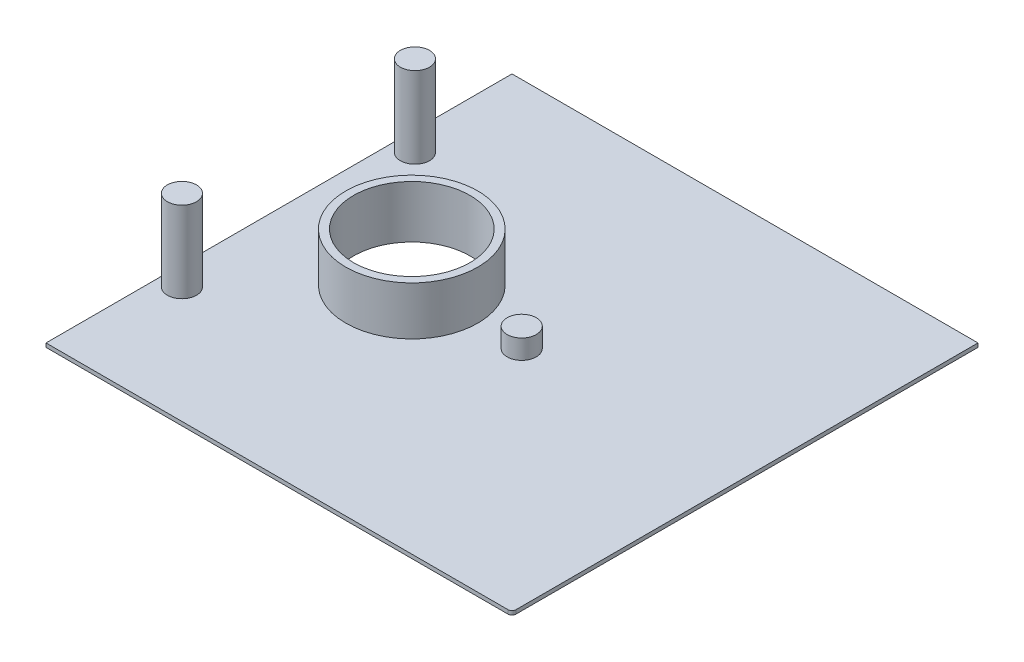
ISO-10303-21;
HEADER;
FILE_DESCRIPTION(('STEP AP214'),'2;1');
FILE_NAME('part.step','',(''),(''),'','','');
FILE_SCHEMA(('AUTOMOTIVE_DESIGN { 1 0 10303 214 1 1 1 1 }'));
ENDSEC;
DATA;
#1=APPLICATION_CONTEXT('core data for automotive mechanical design processes');
#2=APPLICATION_PROTOCOL_DEFINITION('international standard','automotive_design',2000,#1);
#3=PRODUCT_CONTEXT('',#1,'mechanical');
#4=PRODUCT('Part','Part','',(#3));
#5=PRODUCT_RELATED_PRODUCT_CATEGORY('part','',(#4));
#6=PRODUCT_DEFINITION_FORMATION('','',#4);
#7=PRODUCT_DEFINITION_CONTEXT('part definition',#1,'design');
#8=PRODUCT_DEFINITION('design','',#6,#7);
#9=PRODUCT_DEFINITION_SHAPE('','',#8);
#10=(LENGTH_UNIT() NAMED_UNIT(*) SI_UNIT(.MILLI.,.METRE.));
#11=(NAMED_UNIT(*) PLANE_ANGLE_UNIT() SI_UNIT($,.RADIAN.));
#12=(NAMED_UNIT(*) SI_UNIT($,.STERADIAN.) SOLID_ANGLE_UNIT());
#13=UNCERTAINTY_MEASURE_WITH_UNIT(LENGTH_MEASURE(1.E-05),#10,'distance_accuracy_value','');
#14=(GEOMETRIC_REPRESENTATION_CONTEXT(3) GLOBAL_UNCERTAINTY_ASSIGNED_CONTEXT((#13)) GLOBAL_UNIT_ASSIGNED_CONTEXT((#10,
#11,#12)) REPRESENTATION_CONTEXT('',''));
#15=CARTESIAN_POINT('',(0.,0.,0.));
#16=DIRECTION('',(0.,0.,1.));
#17=DIRECTION('',(1.,0.,0.));
#18=AXIS2_PLACEMENT_3D('',#15,#16,#17);
#19=CARTESIAN_POINT('',(0.,2.54000000000001,0.));
#20=DIRECTION('',(0.,1.,0.));
#21=DIRECTION('',(0.,0.,1.));
#22=AXIS2_PLACEMENT_3D('',#19,#20,#21);
#23=PLANE('',#22);
#24=DIRECTION('',(1.,0.,0.));
#25=VECTOR('',#24,1.);
#26=CARTESIAN_POINT('',(-101.6,2.54000000000091,152.4));
#27=LINE('',#26,#25);
#28=CARTESIAN_POINT('',(-101.6,2.54000000000091,152.4));
#29=VERTEX_POINT('',#28);
#30=CARTESIAN_POINT('',(200.66,2.5399999999982,152.4));
#31=VERTEX_POINT('',#30);
#32=EDGE_CURVE('E130',#29,#31,#27,.T.);
#33=ORIENTED_EDGE('',*,*,#32,.T.);
#34=CARTESIAN_POINT('',(200.66,2.5399999999982,149.86));
#35=DIRECTION('',(0.,1.,0.));
#36=DIRECTION('',(0.,0.,1.));
#37=AXIS2_PLACEMENT_3D('',#34,#35,#36);
#38=CIRCLE('',#37,2.54);
#39=CARTESIAN_POINT('',(203.2,2.53999999999818,149.86));
#40=VERTEX_POINT('',#39);
#41=EDGE_CURVE('E12',#31,#40,#38,.T.);
#42=ORIENTED_EDGE('',*,*,#41,.T.);
#43=DIRECTION('',(0.,0.,-1.));
#44=VECTOR('',#43,1.);
#45=CARTESIAN_POINT('',(203.2,2.53999999999817,-152.4));
#46=LINE('',#45,#44);
#47=CARTESIAN_POINT('',(203.2,2.53999999999817,-152.4));
#48=VERTEX_POINT('',#47);
#49=EDGE_CURVE('E84',#40,#48,#46,.T.);
#50=ORIENTED_EDGE('',*,*,#49,.T.);
#51=DIRECTION('',(-1.,0.,0.));
#52=VECTOR('',#51,1.);
#53=CARTESIAN_POINT('',(-101.6,2.54000000000091,-152.4));
#54=LINE('',#53,#52);
#55=CARTESIAN_POINT('',(-101.6,2.54000000000091,-152.4));
#56=VERTEX_POINT('',#55);
#57=EDGE_CURVE('E87',#48,#56,#54,.T.);
#58=ORIENTED_EDGE('',*,*,#57,.T.);
#59=DIRECTION('',(0.,0.,1.));
#60=VECTOR('',#59,1.);
#61=CARTESIAN_POINT('',(-101.6,2.54000000000091,-152.4));
#62=LINE('',#61,#60);
#63=EDGE_CURVE('E103',#56,#29,#62,.T.);
#64=ORIENTED_EDGE('',*,*,#63,.T.);
#65=EDGE_LOOP('',(#33,#42,#50,#58,#64));
#66=FACE_BOUND('',#65,.T.);
#67=CARTESIAN_POINT('',(57.15,2.5399999999995,-9.99200722162641E-13));
#68=DIRECTION('',(0.,1.,0.));
#69=DIRECTION('',(0.,0.,1.));
#70=AXIS2_PLACEMENT_3D('',#67,#68,#69);
#71=CIRCLE('',#70,9.525);
#72=CARTESIAN_POINT('',(57.15,2.5399999999995,9.524999999999));
#73=VERTEX_POINT('',#72);
#74=EDGE_CURVE('E127',#73,#73,#71,.T.);
#75=ORIENTED_EDGE('',*,*,#74,.F.);
#76=EDGE_LOOP('',(#75));
#77=FACE_BOUND('',#76,.T.);
#78=CARTESIAN_POINT('',(-88.9,2.54000000000081,-76.2000000000009));
#79=DIRECTION('',(0.,1.,0.));
#80=DIRECTION('',(0.,0.,1.));
#81=AXIS2_PLACEMENT_3D('',#78,#79,#80);
#82=CIRCLE('',#81,9.52500000000001);
#83=CARTESIAN_POINT('',(-88.9000000000003,2.54000000000082,-85.7250000000001));
#84=VERTEX_POINT('',#83);
#85=EDGE_CURVE('E145',#84,#84,#82,.T.);
#86=ORIENTED_EDGE('',*,*,#85,.F.);
#87=EDGE_LOOP('',(#86));
#88=FACE_BOUND('',#87,.T.);
#89=CARTESIAN_POINT('',(-88.9,2.54000000000078,76.1999999999991));
#90=DIRECTION('',(0.,1.,0.));
#91=DIRECTION('',(0.,0.,1.));
#92=AXIS2_PLACEMENT_3D('',#89,#90,#91);
#93=CIRCLE('',#92,9.52500000000001);
#94=CARTESIAN_POINT('',(-88.9000000000002,2.54000000000076,66.6749999999999));
#95=VERTEX_POINT('',#94);
#96=EDGE_CURVE('E108',#95,#95,#93,.T.);
#97=ORIENTED_EDGE('',*,*,#96,.F.);
#98=EDGE_LOOP('',(#97));
#99=FACE_BOUND('',#98,.T.);
#100=CARTESIAN_POINT('',(-14.741985058765,2.54000000000014,0.));
#101=DIRECTION('',(0.,1.,0.));
#102=DIRECTION('',(0.,0.,1.));
#103=AXIS2_PLACEMENT_3D('',#100,#101,#102);
#104=CIRCLE('',#103,43.18);
#105=CARTESIAN_POINT('',(-14.741985058765,2.54000000000014,43.18));
#106=VERTEX_POINT('',#105);
#107=EDGE_CURVE('E152',#106,#106,#104,.T.);
#108=ORIENTED_EDGE('',*,*,#107,.F.);
#109=EDGE_LOOP('',(#108));
#110=FACE_BOUND('',#109,.T.);
#111=ADVANCED_FACE('F38',(#66,#77,#88,#99,#110),#23,.T.);
#112=CARTESIAN_POINT('',(203.2,2.53999999999817,-152.4));
#113=DIRECTION('',(-1.,0.,0.));
#114=DIRECTION('',(0.,0.,1.));
#115=AXIS2_PLACEMENT_3D('',#112,#113,#114);
#116=PLANE('',#115);
#117=ORIENTED_EDGE('',*,*,#49,.F.);
#118=DIRECTION('',(0.,-1.,0.));
#119=VECTOR('',#118,1.);
#120=CARTESIAN_POINT('',(203.2,2.53999999999818,149.86));
#121=LINE('',#120,#119);
#122=CARTESIAN_POINT('',(203.2,-1.82666382020358E-12,149.86));
#123=VERTEX_POINT('',#122);
#124=EDGE_CURVE('E111',#40,#123,#121,.T.);
#125=ORIENTED_EDGE('',*,*,#124,.T.);
#126=DIRECTION('',(0.,0.,-1.));
#127=VECTOR('',#126,1.);
#128=CARTESIAN_POINT('',(203.2,-1.82276069238263E-12,-152.4));
#129=LINE('',#128,#127);
#130=CARTESIAN_POINT('',(203.2,-1.82276069238263E-12,-152.4));
#131=VERTEX_POINT('',#130);
#132=EDGE_CURVE('E106',#123,#131,#129,.T.);
#133=ORIENTED_EDGE('',*,*,#132,.T.);
#134=DIRECTION('',(0.,-1.,0.));
#135=VECTOR('',#134,1.);
#136=CARTESIAN_POINT('',(203.2,2.53999999999817,-152.4));
#137=LINE('',#136,#135);
#138=EDGE_CURVE('E99',#48,#131,#137,.T.);
#139=ORIENTED_EDGE('',*,*,#138,.F.);
#140=EDGE_LOOP('',(#117,#125,#133,#139));
#141=FACE_BOUND('',#140,.T.);
#142=ADVANCED_FACE('F105',(#141),#116,.F.);
#143=CARTESIAN_POINT('',(-101.6,2.54000000000091,-152.4));
#144=DIRECTION('',(0.,0.,1.));
#145=DIRECTION('',(1.,0.,0.));
#146=AXIS2_PLACEMENT_3D('',#143,#144,#145);
#147=PLANE('',#146);
#148=DIRECTION('',(-1.,0.,0.));
#149=VECTOR('',#148,1.);
#150=CARTESIAN_POINT('',(-101.6,9.17235037922737E-13,-152.4));
#151=LINE('',#150,#149);
#152=CARTESIAN_POINT('',(-101.6,9.17235037922737E-13,-152.4));
#153=VERTEX_POINT('',#152);
#154=EDGE_CURVE('E121',#131,#153,#151,.T.);
#155=ORIENTED_EDGE('',*,*,#154,.T.);
#156=DIRECTION('',(0.,-1.,0.));
#157=VECTOR('',#156,1.);
#158=CARTESIAN_POINT('',(-101.6,2.54000000000091,-152.4));
#159=LINE('',#158,#157);
#160=EDGE_CURVE('E101',#56,#153,#159,.T.);
#161=ORIENTED_EDGE('',*,*,#160,.F.);
#162=ORIENTED_EDGE('',*,*,#57,.F.);
#163=ORIENTED_EDGE('',*,*,#138,.T.);
#164=EDGE_LOOP('',(#155,#161,#162,#163));
#165=FACE_BOUND('',#164,.T.);
#166=ADVANCED_FACE('F98',(#165),#147,.F.);
#167=CARTESIAN_POINT('',(-101.6,2.54000000000091,-152.4));
#168=DIRECTION('',(1.,0.,0.));
#169=DIRECTION('',(0.,0.,-1.));
#170=AXIS2_PLACEMENT_3D('',#167,#168,#169);
#171=PLANE('',#170);
#172=DIRECTION('',(0.,0.,1.));
#173=VECTOR('',#172,1.);
#174=CARTESIAN_POINT('',(-101.6,9.17235037922737E-13,-152.4));
#175=LINE('',#174,#173);
#176=CARTESIAN_POINT('',(-101.6,9.21138165743685E-13,152.4));
#177=VERTEX_POINT('',#176);
#178=EDGE_CURVE('E124',#153,#177,#175,.T.);
#179=ORIENTED_EDGE('',*,*,#178,.T.);
#180=DIRECTION('',(0.,-1.,0.));
#181=VECTOR('',#180,1.);
#182=CARTESIAN_POINT('',(-101.6,2.54000000000091,152.4));
#183=LINE('',#182,#181);
#184=EDGE_CURVE('E113',#29,#177,#183,.T.);
#185=ORIENTED_EDGE('',*,*,#184,.F.);
#186=ORIENTED_EDGE('',*,*,#63,.F.);
#187=ORIENTED_EDGE('',*,*,#160,.T.);
#188=EDGE_LOOP('',(#179,#185,#186,#187));
#189=FACE_BOUND('',#188,.T.);
#190=ADVANCED_FACE('F190',(#189),#171,.F.);
#191=CARTESIAN_POINT('',(-101.6,2.54000000000091,152.4));
#192=DIRECTION('',(0.,0.,-1.));
#193=DIRECTION('',(-1.,0.,0.));
#194=AXIS2_PLACEMENT_3D('',#191,#192,#193);
#195=PLANE('',#194);
#196=DIRECTION('',(1.,0.,0.));
#197=VECTOR('',#196,1.);
#198=CARTESIAN_POINT('',(-101.6,9.21138165743685E-13,152.4));
#199=LINE('',#198,#197);
#200=CARTESIAN_POINT('',(200.66,-1.79934192545694E-12,152.4));
#201=VERTEX_POINT('',#200);
#202=EDGE_CURVE('E94',#177,#201,#199,.T.);
#203=ORIENTED_EDGE('',*,*,#202,.T.);
#204=DIRECTION('',(0.,-1.,0.));
#205=VECTOR('',#204,1.);
#206=CARTESIAN_POINT('',(200.66,2.5399999999982,152.4));
#207=LINE('',#206,#205);
#208=EDGE_CURVE('E46',#201,#31,#207,.F.);
#209=ORIENTED_EDGE('',*,*,#208,.T.);
#210=ORIENTED_EDGE('',*,*,#32,.F.);
#211=ORIENTED_EDGE('',*,*,#184,.T.);
#212=EDGE_LOOP('',(#203,#209,#210,#211));
#213=FACE_BOUND('',#212,.T.);
#214=ADVANCED_FACE('F186',(#213),#195,.F.);
#215=CARTESIAN_POINT('',(0.,0.,0.));
#216=DIRECTION('',(0.,1.,0.));
#217=DIRECTION('',(0.,0.,1.));
#218=AXIS2_PLACEMENT_3D('',#215,#216,#217);
#219=PLANE('',#218);
#220=CARTESIAN_POINT('',(-14.7419850587649,1.36609473733174E-13,0.));
#221=DIRECTION('',(0.,1.,0.));
#222=DIRECTION('',(0.,0.,1.));
#223=AXIS2_PLACEMENT_3D('',#220,#221,#222);
#224=CIRCLE('',#223,38.1);
#225=CARTESIAN_POINT('',(-14.7419850587649,1.3660947373319E-13,38.1));
#226=VERTEX_POINT('',#225);
#227=EDGE_CURVE('E138',#226,#226,#224,.T.);
#228=ORIENTED_EDGE('',*,*,#227,.T.);
#229=EDGE_LOOP('',(#228));
#230=FACE_BOUND('',#229,.T.);
#231=ORIENTED_EDGE('',*,*,#132,.F.);
#232=CARTESIAN_POINT('',(200.66,-1.80324505327789E-12,149.86));
#233=DIRECTION('',(0.,1.,0.));
#234=DIRECTION('',(0.,0.,1.));
#235=AXIS2_PLACEMENT_3D('',#232,#233,#234);
#236=CIRCLE('',#235,2.54);
#237=EDGE_CURVE('E60',#123,#201,#236,.F.);
#238=ORIENTED_EDGE('',*,*,#237,.T.);
#239=ORIENTED_EDGE('',*,*,#202,.F.);
#240=ORIENTED_EDGE('',*,*,#178,.F.);
#241=ORIENTED_EDGE('',*,*,#154,.F.);
#242=EDGE_LOOP('',(#231,#238,#239,#240,#241));
#243=FACE_BOUND('',#242,.T.);
#244=ADVANCED_FACE('F119',(#230,#243),#219,.F.);
#245=CARTESIAN_POINT('',(57.15,15.2399999999995,-9.99200722162641E-13));
#246=DIRECTION('',(0.,-1.,0.));
#247=DIRECTION('',(0.,0.,-1.));
#248=AXIS2_PLACEMENT_3D('',#245,#246,#247);
#249=CYLINDRICAL_SURFACE('',#248,9.525);
#250=CARTESIAN_POINT('',(57.15,15.2399999999995,-9.99200722162641E-13));
#251=DIRECTION('',(0.,1.,0.));
#252=DIRECTION('',(0.,0.,1.));
#253=AXIS2_PLACEMENT_3D('',#250,#251,#252);
#254=CIRCLE('',#253,9.525);
#255=CARTESIAN_POINT('',(57.15,15.2399999999995,9.524999999999));
#256=VERTEX_POINT('',#255);
#257=EDGE_CURVE('E122',#256,#256,#254,.T.);
#258=ORIENTED_EDGE('',*,*,#257,.F.);
#259=EDGE_LOOP('',(#258));
#260=FACE_BOUND('',#259,.T.);
#261=ORIENTED_EDGE('',*,*,#74,.T.);
#262=EDGE_LOOP('',(#261));
#263=FACE_BOUND('',#262,.T.);
#264=ADVANCED_FACE('F182',(#260,#263),#249,.T.);
#265=CARTESIAN_POINT('',(57.15,15.2399999999995,-9.99200722162641E-13));
#266=DIRECTION('',(0.,1.,0.));
#267=DIRECTION('',(0.,0.,1.));
#268=AXIS2_PLACEMENT_3D('',#265,#266,#267);
#269=PLANE('',#268);
#270=ORIENTED_EDGE('',*,*,#257,.T.);
#271=EDGE_LOOP('',(#270));
#272=FACE_BOUND('',#271,.T.);
#273=ADVANCED_FACE('F217',(#272),#269,.T.);
#274=CARTESIAN_POINT('',(-14.7419850587649,1.36609473733174E-13,0.));
#275=DIRECTION('',(0.,1.,0.));
#276=DIRECTION('',(0.,0.,1.));
#277=AXIS2_PLACEMENT_3D('',#274,#275,#276);
#278=CYLINDRICAL_SURFACE('',#277,38.1);
#279=ORIENTED_EDGE('',*,*,#227,.F.);
#280=EDGE_LOOP('',(#279));
#281=FACE_BOUND('',#280,.T.);
#282=CARTESIAN_POINT('',(-14.7419850587652,34.2900000000001,-9.99200722162641E-13));
#283=DIRECTION('',(0.,1.,0.));
#284=DIRECTION('',(0.,0.,1.));
#285=AXIS2_PLACEMENT_3D('',#282,#283,#284);
#286=CIRCLE('',#285,38.1);
#287=CARTESIAN_POINT('',(-14.7419850587652,34.2900000000001,38.099999999999));
#288=VERTEX_POINT('',#287);
#289=EDGE_CURVE('E155',#288,#288,#286,.T.);
#290=ORIENTED_EDGE('',*,*,#289,.T.);
#291=EDGE_LOOP('',(#290));
#292=FACE_BOUND('',#291,.T.);
#293=ADVANCED_FACE('F161',(#281,#292),#278,.F.);
#294=CARTESIAN_POINT('',(-88.9000000000015,138.065768363208,-76.2));
#295=DIRECTION('',(0.,-1.,0.));
#296=DIRECTION('',(0.,0.,-1.));
#297=AXIS2_PLACEMENT_3D('',#294,#295,#296);
#298=CYLINDRICAL_SURFACE('',#297,9.52500000000001);
#299=CARTESIAN_POINT('',(-88.9000000000004,55.5625000000008,-76.2));
#300=DIRECTION('',(0.,1.,0.));
#301=DIRECTION('',(0.,0.,1.));
#302=AXIS2_PLACEMENT_3D('',#299,#300,#301);
#303=CIRCLE('',#302,9.52500000000001);
#304=CARTESIAN_POINT('',(-88.9000000000007,55.5625000000008,-85.7250000000001));
#305=VERTEX_POINT('',#304);
#306=EDGE_CURVE('E142',#305,#305,#303,.T.);
#307=CARTESIAN_POINT('',(-88.9000000000003,2.54000000000082,-85.7250000000001));
#308=CARTESIAN_POINT('',(-88.9000000000003,3.09231770833415,-85.7250000000001));
#309=CARTESIAN_POINT('',(-88.9000000000003,3.64463541666749,-85.7250000000001));
#310=CARTESIAN_POINT('',(-88.9000000000003,4.74927083333415,-85.7250000000001));
#311=CARTESIAN_POINT('',(-88.9000000000003,5.30158854166748,-85.7250000000001));
#312=CARTESIAN_POINT('',(-88.9000000000003,6.40622395833415,-85.7250000000001));
#313=CARTESIAN_POINT('',(-88.9000000000003,6.95854166666748,-85.7250000000001));
#314=CARTESIAN_POINT('',(-88.9000000000003,8.06317708333415,-85.7250000000001));
#315=CARTESIAN_POINT('',(-88.9000000000003,8.61549479166748,-85.7250000000001));
#316=CARTESIAN_POINT('',(-88.9000000000003,9.72013020833415,-85.7250000000001));
#317=CARTESIAN_POINT('',(-88.9000000000003,10.2724479166675,-85.7250000000001));
#318=CARTESIAN_POINT('',(-88.9000000000003,11.3770833333341,-85.7250000000001));
#319=CARTESIAN_POINT('',(-88.9000000000003,11.9294010416675,-85.7250000000001));
#320=CARTESIAN_POINT('',(-88.9000000000003,13.0340364583341,-85.7250000000001));
#321=CARTESIAN_POINT('',(-88.9000000000004,13.5863541666675,-85.7250000000001));
#322=CARTESIAN_POINT('',(-88.9000000000004,14.6909895833341,-85.7250000000001));
#323=CARTESIAN_POINT('',(-88.9000000000004,15.2433072916675,-85.7250000000001));
#324=CARTESIAN_POINT('',(-88.9000000000004,16.3479427083341,-85.7250000000001));
#325=CARTESIAN_POINT('',(-88.9000000000004,16.9002604166675,-85.7250000000001));
#326=CARTESIAN_POINT('',(-88.9000000000004,18.0048958333341,-85.7250000000001));
#327=CARTESIAN_POINT('',(-88.9000000000004,18.5572135416675,-85.7250000000001));
#328=CARTESIAN_POINT('',(-88.9000000000004,19.6618489583341,-85.7250000000001));
#329=CARTESIAN_POINT('',(-88.9000000000004,20.2141666666675,-85.7250000000001));
#330=CARTESIAN_POINT('',(-88.9000000000004,21.3188020833341,-85.7250000000001));
#331=CARTESIAN_POINT('',(-88.9000000000004,21.8711197916675,-85.7250000000001));
#332=CARTESIAN_POINT('',(-88.9000000000004,22.9757552083341,-85.7250000000001));
#333=CARTESIAN_POINT('',(-88.9000000000004,23.5280729166675,-85.7250000000001));
#334=CARTESIAN_POINT('',(-88.9000000000004,24.6327083333341,-85.7250000000001));
#335=CARTESIAN_POINT('',(-88.9000000000005,25.1850260416675,-85.7250000000001));
#336=CARTESIAN_POINT('',(-88.9000000000005,26.2896614583341,-85.7250000000001));
#337=CARTESIAN_POINT('',(-88.9000000000005,26.8419791666675,-85.7250000000001));
#338=CARTESIAN_POINT('',(-88.9000000000005,27.9466145833341,-85.7250000000001));
#339=CARTESIAN_POINT('',(-88.9000000000005,28.4989322916675,-85.7250000000001));
#340=CARTESIAN_POINT('',(-88.9000000000005,29.6035677083341,-85.7250000000001));
#341=CARTESIAN_POINT('',(-88.9000000000005,30.1558854166675,-85.7250000000001));
#342=CARTESIAN_POINT('',(-88.9000000000005,31.2605208333341,-85.7250000000001));
#343=CARTESIAN_POINT('',(-88.9000000000005,31.8128385416675,-85.7250000000001));
#344=CARTESIAN_POINT('',(-88.9000000000005,32.9174739583341,-85.7250000000001));
#345=CARTESIAN_POINT('',(-88.9000000000005,33.4697916666675,-85.7250000000001));
#346=CARTESIAN_POINT('',(-88.9000000000005,34.5744270833341,-85.7250000000001));
#347=CARTESIAN_POINT('',(-88.9000000000006,35.1267447916675,-85.7250000000001));
#348=CARTESIAN_POINT('',(-88.9000000000006,36.2313802083341,-85.7250000000001));
#349=CARTESIAN_POINT('',(-88.9000000000006,36.7836979166675,-85.7250000000001));
#350=CARTESIAN_POINT('',(-88.9000000000006,37.8883333333341,-85.7250000000001));
#351=CARTESIAN_POINT('',(-88.9000000000006,38.4406510416675,-85.7250000000001));
#352=CARTESIAN_POINT('',(-88.9000000000006,39.5452864583341,-85.7250000000001));
#353=CARTESIAN_POINT('',(-88.9000000000006,40.0976041666675,-85.7250000000001));
#354=CARTESIAN_POINT('',(-88.9000000000006,41.2022395833341,-85.7250000000001));
#355=CARTESIAN_POINT('',(-88.9000000000006,41.7545572916675,-85.7250000000001));
#356=CARTESIAN_POINT('',(-88.9000000000006,42.8591927083341,-85.7250000000001));
#357=CARTESIAN_POINT('',(-88.9000000000006,43.4115104166675,-85.7250000000001));
#358=CARTESIAN_POINT('',(-88.9000000000006,44.5161458333341,-85.7250000000001));
#359=CARTESIAN_POINT('',(-88.9000000000006,45.0684635416675,-85.7250000000001));
#360=CARTESIAN_POINT('',(-88.9000000000006,46.1730989583341,-85.7250000000001));
#361=CARTESIAN_POINT('',(-88.9000000000007,46.7254166666675,-85.7250000000001));
#362=CARTESIAN_POINT('',(-88.9000000000007,47.8300520833341,-85.7250000000001));
#363=CARTESIAN_POINT('',(-88.9000000000007,48.3823697916675,-85.7250000000001));
#364=CARTESIAN_POINT('',(-88.9000000000007,49.4870052083341,-85.7250000000001));
#365=CARTESIAN_POINT('',(-88.9000000000007,50.0393229166675,-85.7250000000001));
#366=CARTESIAN_POINT('',(-88.9000000000007,51.1439583333341,-85.7250000000001));
#367=CARTESIAN_POINT('',(-88.9000000000007,51.6962760416675,-85.7250000000001));
#368=CARTESIAN_POINT('',(-88.9000000000007,52.8009114583341,-85.7250000000001));
#369=CARTESIAN_POINT('',(-88.9000000000007,53.3532291666675,-85.7250000000001));
#370=CARTESIAN_POINT('',(-88.9000000000007,54.4578645833341,-85.7250000000001));
#371=CARTESIAN_POINT('',(-88.9000000000007,55.0101822916675,-85.7250000000001));
#372=CARTESIAN_POINT('',(-88.9000000000007,55.5625000000008,-85.7250000000001));
#373=B_SPLINE_CURVE_WITH_KNOTS('',3,(#307,#308,#309,#310,#311,#312,#313,#314,#315,#316,#317,
#318,#319,#320,#321,#322,#323,#324,#325,#326,#327,#328,#329,#330,#331,#332,#333,#334,#335,#336,
#337,#338,#339,#340,#341,#342,#343,#344,#345,#346,#347,#348,#349,#350,#351,#352,#353,#354,#355,
#356,#357,#358,#359,#360,#361,#362,#363,#364,#365,#366,#367,#368,#369,#370,#371,#372),
.UNSPECIFIED.,.F.,.F.,(4,2,2,2,2,2,2,2,2,2,2,2,2,2,2,2,2,2,2,2,2,2,2,2,2,2,2,2,2,2,2,2,4),(0.,
1.656953125,3.31390625,4.970859375,6.6278125,8.284765625,9.94171874999999,11.598671875,
13.255625,14.912578125,16.56953125,18.226484375,19.8834375,21.540390625,23.19734375,
24.854296875,26.51125,28.168203125,29.82515625,31.482109375,33.1390625,34.796015625,36.45296875,
38.109921875,39.766875,41.423828125,43.08078125,44.737734375,46.3946875,48.051640625,
49.70859375,51.365546875,53.0225),.UNSPECIFIED.);
#374=EDGE_CURVE('BSEAM230',#84,#305,#373,.T.);
#375=ORIENTED_EDGE('',*,*,#85,.T.);
#376=ORIENTED_EDGE('',*,*,#306,.F.);
#377=ORIENTED_EDGE('',*,*,#374,.T.);
#378=ORIENTED_EDGE('',*,*,#374,.F.);
#379=EDGE_LOOP('',(#375,#377,#376,#378));
#380=FACE_BOUND('',#379,.T.);
#381=ADVANCED_FACE('F230',(#380),#298,.T.);
#382=CARTESIAN_POINT('',(-4.9960036108132E-13,55.5625000000001,0.));
#383=DIRECTION('',(0.,1.,0.));
#384=DIRECTION('',(0.,0.,1.));
#385=AXIS2_PLACEMENT_3D('',#382,#383,#384);
#386=PLANE('',#385);
#387=ORIENTED_EDGE('',*,*,#306,.T.);
#388=EDGE_LOOP('',(#387));
#389=FACE_BOUND('',#388,.T.);
#390=ADVANCED_FACE('F238',(#389),#386,.T.);
#391=CARTESIAN_POINT('',(-4.9960036108132E-13,55.5625000000001,0.));
#392=DIRECTION('',(0.,1.,0.));
#393=DIRECTION('',(0.,0.,1.));
#394=AXIS2_PLACEMENT_3D('',#391,#392,#393);
#395=PLANE('',#394);
#396=CARTESIAN_POINT('',(-88.9000000000006,55.5625000000008,76.1999999999999));
#397=DIRECTION('',(0.,1.,0.));
#398=DIRECTION('',(0.,0.,1.));
#399=AXIS2_PLACEMENT_3D('',#396,#397,#398);
#400=CIRCLE('',#399,9.52500000000001);
#401=CARTESIAN_POINT('',(-88.9000000000007,55.5625000000008,66.6749999999999));
#402=VERTEX_POINT('',#401);
#403=EDGE_CURVE('E148',#402,#402,#400,.F.);
#404=ORIENTED_EDGE('',*,*,#403,.F.);
#405=EDGE_LOOP('',(#404));
#406=FACE_BOUND('',#405,.T.);
#407=ADVANCED_FACE('F246',(#406),#395,.T.);
#408=CARTESIAN_POINT('',(-88.9000000000015,138.065768363208,76.1999999999999));
#409=DIRECTION('',(0.,-1.,0.));
#410=DIRECTION('',(0.,0.,-1.));
#411=AXIS2_PLACEMENT_3D('',#408,#409,#410);
#412=CYLINDRICAL_SURFACE('',#411,9.52500000000001);
#413=CARTESIAN_POINT('',(-88.9000000000002,2.54000000000076,66.6749999999999));
#414=CARTESIAN_POINT('',(-88.9000000000002,3.0923177083341,66.6749999999999));
#415=CARTESIAN_POINT('',(-88.9000000000002,3.64463541666743,66.6749999999999));
#416=CARTESIAN_POINT('',(-88.9000000000002,4.7492708333341,66.6749999999999));
#417=CARTESIAN_POINT('',(-88.9000000000003,5.30158854166743,66.6749999999999));
#418=CARTESIAN_POINT('',(-88.9000000000003,6.4062239583341,66.6749999999999));
#419=CARTESIAN_POINT('',(-88.9000000000003,6.95854166666743,66.6749999999999));
#420=CARTESIAN_POINT('',(-88.9000000000003,8.06317708333409,66.6749999999999));
#421=CARTESIAN_POINT('',(-88.9000000000003,8.61549479166743,66.6749999999999));
#422=CARTESIAN_POINT('',(-88.9000000000003,9.7201302083341,66.6749999999999));
#423=CARTESIAN_POINT('',(-88.9000000000003,10.2724479166674,66.6749999999999));
#424=CARTESIAN_POINT('',(-88.9000000000003,11.3770833333341,66.6749999999999));
#425=CARTESIAN_POINT('',(-88.9000000000003,11.9294010416675,66.6749999999999));
#426=CARTESIAN_POINT('',(-88.9000000000003,13.0340364583341,66.6749999999999));
#427=CARTESIAN_POINT('',(-88.9000000000003,13.5863541666674,66.6749999999999));
#428=CARTESIAN_POINT('',(-88.9000000000003,14.6909895833341,66.6749999999999));
#429=CARTESIAN_POINT('',(-88.9000000000003,15.2433072916674,66.6749999999999));
#430=CARTESIAN_POINT('',(-88.9000000000003,16.3479427083341,66.6749999999999));
#431=CARTESIAN_POINT('',(-88.9000000000004,16.9002604166674,66.6749999999999));
#432=CARTESIAN_POINT('',(-88.9000000000004,18.0048958333341,66.6749999999999));
#433=CARTESIAN_POINT('',(-88.9000000000004,18.5572135416674,66.6749999999999));
#434=CARTESIAN_POINT('',(-88.9000000000004,19.6618489583341,66.6749999999999));
#435=CARTESIAN_POINT('',(-88.9000000000004,20.2141666666674,66.6749999999999));
#436=CARTESIAN_POINT('',(-88.9000000000004,21.3188020833341,66.6749999999999));
#437=CARTESIAN_POINT('',(-88.9000000000004,21.8711197916674,66.6749999999999));
#438=CARTESIAN_POINT('',(-88.9000000000004,22.9757552083341,66.6749999999999));
#439=CARTESIAN_POINT('',(-88.9000000000004,23.5280729166674,66.6749999999999));
#440=CARTESIAN_POINT('',(-88.9000000000004,24.6327083333341,66.6749999999999));
#441=CARTESIAN_POINT('',(-88.9000000000004,25.1850260416674,66.6749999999999));
#442=CARTESIAN_POINT('',(-88.9000000000004,26.2896614583341,66.6749999999999));
#443=CARTESIAN_POINT('',(-88.9000000000004,26.8419791666674,66.6749999999999));
#444=CARTESIAN_POINT('',(-88.9000000000004,27.9466145833341,66.6749999999999));
#445=CARTESIAN_POINT('',(-88.9000000000005,28.4989322916674,66.6749999999999));
#446=CARTESIAN_POINT('',(-88.9000000000005,29.6035677083341,66.6749999999999));
#447=CARTESIAN_POINT('',(-88.9000000000005,30.1558854166674,66.6749999999999));
#448=CARTESIAN_POINT('',(-88.9000000000005,31.2605208333341,66.6749999999999));
#449=CARTESIAN_POINT('',(-88.9000000000005,31.8128385416674,66.6749999999999));
#450=CARTESIAN_POINT('',(-88.9000000000005,32.9174739583341,66.6749999999999));
#451=CARTESIAN_POINT('',(-88.9000000000005,33.4697916666675,66.6749999999999));
#452=CARTESIAN_POINT('',(-88.9000000000005,34.5744270833341,66.6749999999999));
#453=CARTESIAN_POINT('',(-88.9000000000005,35.1267447916675,66.6749999999999));
#454=CARTESIAN_POINT('',(-88.9000000000005,36.2313802083341,66.6749999999999));
#455=CARTESIAN_POINT('',(-88.9000000000005,36.7836979166675,66.6749999999999));
#456=CARTESIAN_POINT('',(-88.9000000000005,37.8883333333341,66.6749999999999));
#457=CARTESIAN_POINT('',(-88.9000000000006,38.4406510416675,66.6749999999999));
#458=CARTESIAN_POINT('',(-88.9000000000006,39.5452864583341,66.6749999999999));
#459=CARTESIAN_POINT('',(-88.9000000000006,40.0976041666675,66.6749999999999));
#460=CARTESIAN_POINT('',(-88.9000000000006,41.2022395833341,66.6749999999999));
#461=CARTESIAN_POINT('',(-88.9000000000006,41.7545572916675,66.6749999999999));
#462=CARTESIAN_POINT('',(-88.9000000000006,42.8591927083341,66.6749999999999));
#463=CARTESIAN_POINT('',(-88.9000000000006,43.4115104166675,66.6749999999999));
#464=CARTESIAN_POINT('',(-88.9000000000006,44.5161458333341,66.6749999999999));
#465=CARTESIAN_POINT('',(-88.9000000000006,45.0684635416675,66.6749999999999));
#466=CARTESIAN_POINT('',(-88.9000000000006,46.1730989583341,66.6749999999999));
#467=CARTESIAN_POINT('',(-88.9000000000006,46.7254166666675,66.6749999999999));
#468=CARTESIAN_POINT('',(-88.9000000000006,47.8300520833341,66.6749999999999));
#469=CARTESIAN_POINT('',(-88.9000000000006,48.3823697916675,66.6749999999999));
#470=CARTESIAN_POINT('',(-88.9000000000006,49.4870052083341,66.6749999999999));
#471=CARTESIAN_POINT('',(-88.9000000000007,50.0393229166675,66.6749999999999));
#472=CARTESIAN_POINT('',(-88.9000000000007,51.1439583333341,66.6749999999999));
#473=CARTESIAN_POINT('',(-88.9000000000007,51.6962760416675,66.6749999999999));
#474=CARTESIAN_POINT('',(-88.9000000000007,52.8009114583341,66.6749999999999));
#475=CARTESIAN_POINT('',(-88.9000000000007,53.3532291666675,66.6749999999999));
#476=CARTESIAN_POINT('',(-88.9000000000007,54.4578645833341,66.6749999999999));
#477=CARTESIAN_POINT('',(-88.9000000000007,55.0101822916675,66.6749999999999));
#478=CARTESIAN_POINT('',(-88.9000000000007,55.5625000000008,66.6749999999999));
#479=B_SPLINE_CURVE_WITH_KNOTS('',3,(#413,#414,#415,#416,#417,#418,#419,#420,#421,#422,#423,
#424,#425,#426,#427,#428,#429,#430,#431,#432,#433,#434,#435,#436,#437,#438,#439,#440,#441,#442,
#443,#444,#445,#446,#447,#448,#449,#450,#451,#452,#453,#454,#455,#456,#457,#458,#459,#460,#461,
#462,#463,#464,#465,#466,#467,#468,#469,#470,#471,#472,#473,#474,#475,#476,#477,#478),
.UNSPECIFIED.,.F.,.F.,(4,2,2,2,2,2,2,2,2,2,2,2,2,2,2,2,2,2,2,2,2,2,2,2,2,2,2,2,2,2,2,2,4),(0.,
1.656953125,3.31390625,4.970859375,6.6278125,8.28476562500002,9.94171875000002,11.598671875,
13.255625,14.912578125,16.56953125,18.226484375,19.8834375,21.540390625,23.19734375,
24.854296875,26.51125,28.168203125,29.82515625,31.482109375,33.1390625,34.796015625,36.45296875,
38.109921875,39.766875,41.423828125,43.08078125,44.737734375,46.3946875,48.051640625,
49.70859375,51.365546875,53.0225),.UNSPECIFIED.);
#480=EDGE_CURVE('BSEAM174',#95,#402,#479,.T.);
#481=ORIENTED_EDGE('',*,*,#96,.T.);
#482=ORIENTED_EDGE('',*,*,#403,.T.);
#483=ORIENTED_EDGE('',*,*,#480,.T.);
#484=ORIENTED_EDGE('',*,*,#480,.F.);
#485=EDGE_LOOP('',(#481,#483,#482,#484));
#486=FACE_BOUND('',#485,.T.);
#487=ADVANCED_FACE('F174',(#486),#412,.T.);
#488=CARTESIAN_POINT('',(200.66,2.5399999999982,149.86));
#489=DIRECTION('',(0.,-1.,0.));
#490=DIRECTION('',(0.,0.,-1.));
#491=AXIS2_PLACEMENT_3D('',#488,#489,#490);
#492=CYLINDRICAL_SURFACE('',#491,2.54);
#493=ORIENTED_EDGE('',*,*,#41,.F.);
#494=ORIENTED_EDGE('',*,*,#208,.F.);
#495=ORIENTED_EDGE('',*,*,#237,.F.);
#496=ORIENTED_EDGE('',*,*,#124,.F.);
#497=EDGE_LOOP('',(#493,#494,#495,#496));
#498=FACE_BOUND('',#497,.T.);
#499=ADVANCED_FACE('F40',(#498),#492,.T.);
#500=CARTESIAN_POINT('',(-14.7419850587652,34.2900000000001,-9.99200722162641E-13));
#501=DIRECTION('',(0.,1.,0.));
#502=DIRECTION('',(0.,0.,1.));
#503=AXIS2_PLACEMENT_3D('',#500,#501,#502);
#504=PLANE('',#503);
#505=CARTESIAN_POINT('',(-14.7419850587652,34.2900000000001,-9.99200722162641E-13));
#506=DIRECTION('',(0.,1.,0.));
#507=DIRECTION('',(0.,0.,1.));
#508=AXIS2_PLACEMENT_3D('',#505,#506,#507);
#509=CIRCLE('',#508,43.18);
#510=CARTESIAN_POINT('',(-14.7419850587652,34.2900000000001,43.179999999999));
#511=VERTEX_POINT('',#510);
#512=EDGE_CURVE('E151',#511,#511,#509,.T.);
#513=ORIENTED_EDGE('',*,*,#512,.T.);
#514=EDGE_LOOP('',(#513));
#515=FACE_BOUND('',#514,.T.);
#516=ORIENTED_EDGE('',*,*,#289,.F.);
#517=EDGE_LOOP('',(#516));
#518=FACE_BOUND('',#517,.T.);
#519=ADVANCED_FACE('F163',(#515,#518),#504,.T.);
#520=CARTESIAN_POINT('',(-14.7419850587652,34.2900000000001,-9.99200722162641E-13));
#521=DIRECTION('',(0.,-1.,0.));
#522=DIRECTION('',(0.,0.,-1.));
#523=AXIS2_PLACEMENT_3D('',#520,#521,#522);
#524=CYLINDRICAL_SURFACE('',#523,43.18);
#525=ORIENTED_EDGE('',*,*,#512,.F.);
#526=EDGE_LOOP('',(#525));
#527=FACE_BOUND('',#526,.T.);
#528=ORIENTED_EDGE('',*,*,#107,.T.);
#529=EDGE_LOOP('',(#528));
#530=FACE_BOUND('',#529,.T.);
#531=ADVANCED_FACE('F165',(#527,#530),#524,.T.);
#532=CLOSED_SHELL('',(#111,#142,#166,#190,#214,#244,#264,#273,#293,#381,#390,#407,#487,#499,
#519,#531));
#533=MANIFOLD_SOLID_BREP('B2',#532);
#534=ADVANCED_BREP_SHAPE_REPRESENTATION('',(#18,#533),#14);
#535=SHAPE_DEFINITION_REPRESENTATION(#9,#534);
ENDSEC;
END-ISO-10303-21;
